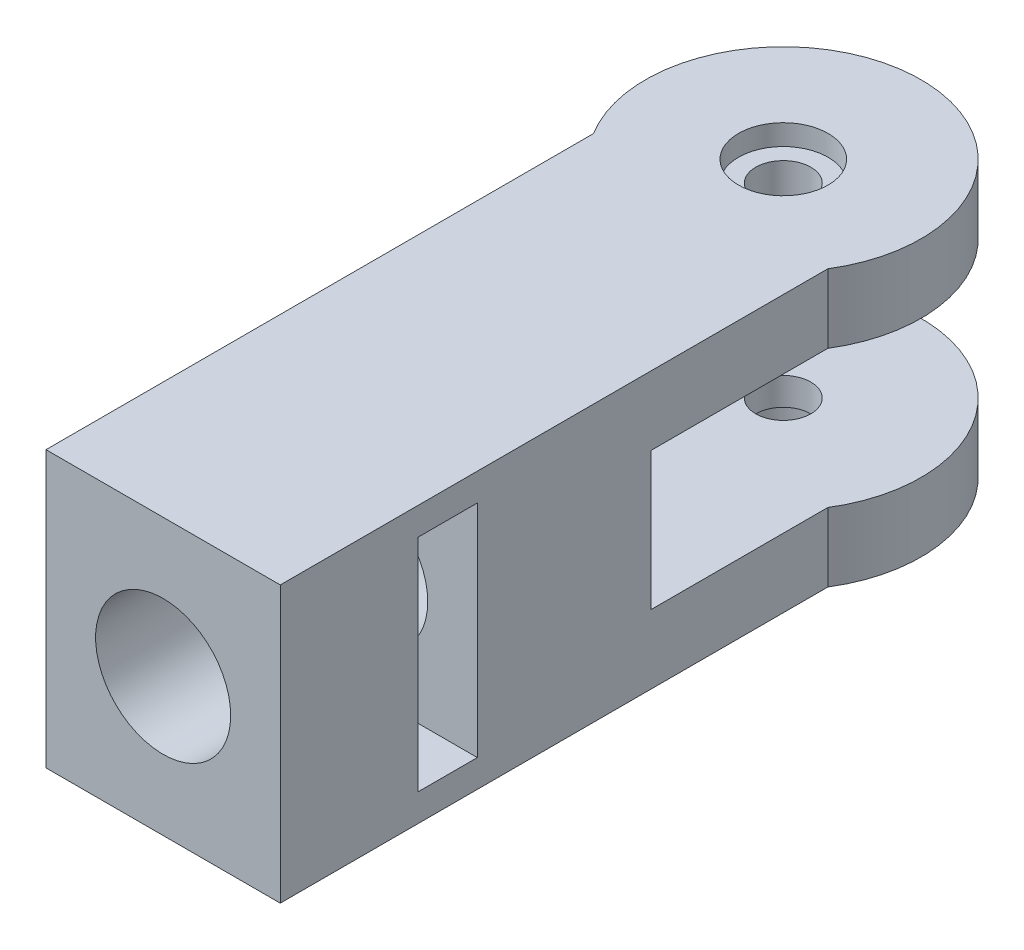
ISO-10303-21;
HEADER;
FILE_DESCRIPTION(('STEP AP214'),'2;1');
FILE_NAME('part.step','',(''),(''),'','','');
FILE_SCHEMA(('AUTOMOTIVE_DESIGN { 1 0 10303 214 1 1 1 1 }'));
ENDSEC;
DATA;
#1=APPLICATION_CONTEXT('core data for automotive mechanical design processes');
#2=APPLICATION_PROTOCOL_DEFINITION('international standard','automotive_design',2000,#1);
#3=PRODUCT_CONTEXT('',#1,'mechanical');
#4=PRODUCT('Part','Part','',(#3));
#5=PRODUCT_RELATED_PRODUCT_CATEGORY('part','',(#4));
#6=PRODUCT_DEFINITION_FORMATION('','',#4);
#7=PRODUCT_DEFINITION_CONTEXT('part definition',#1,'design');
#8=PRODUCT_DEFINITION('design','',#6,#7);
#9=PRODUCT_DEFINITION_SHAPE('','',#8);
#10=(LENGTH_UNIT() NAMED_UNIT(*) SI_UNIT(.MILLI.,.METRE.));
#11=(NAMED_UNIT(*) PLANE_ANGLE_UNIT() SI_UNIT($,.RADIAN.));
#12=(NAMED_UNIT(*) SI_UNIT($,.STERADIAN.) SOLID_ANGLE_UNIT());
#13=UNCERTAINTY_MEASURE_WITH_UNIT(LENGTH_MEASURE(1.E-05),#10,'distance_accuracy_value','');
#14=(GEOMETRIC_REPRESENTATION_CONTEXT(3) GLOBAL_UNCERTAINTY_ASSIGNED_CONTEXT((#13)) GLOBAL_UNIT_ASSIGNED_CONTEXT((#10,
#11,#12)) REPRESENTATION_CONTEXT('',''));
#15=CARTESIAN_POINT('',(0.,0.,0.));
#16=DIRECTION('',(0.,0.,1.));
#17=DIRECTION('',(1.,0.,0.));
#18=AXIS2_PLACEMENT_3D('',#15,#16,#17);
#19=CARTESIAN_POINT('',(-10.8284462163294,-12.3437960912953,-5.));
#20=DIRECTION('',(0.,1.,0.));
#21=DIRECTION('',(0.,0.,1.));
#22=AXIS2_PLACEMENT_3D('',#19,#20,#21);
#23=CYLINDRICAL_SURFACE('',#22,2.);
#24=CARTESIAN_POINT('',(-10.8284462163294,-12.3437960912953,-5.));
#25=DIRECTION('',(0.,1.,0.));
#26=DIRECTION('',(0.,0.,1.));
#27=AXIS2_PLACEMENT_3D('',#24,#25,#26);
#28=CIRCLE('',#27,2.);
#29=CARTESIAN_POINT('',(-10.8284462163294,-12.3437960912953,-3.));
#30=VERTEX_POINT('',#29);
#31=EDGE_CURVE('E295',#30,#30,#28,.T.);
#32=ORIENTED_EDGE('',*,*,#31,.F.);
#33=EDGE_LOOP('',(#32));
#34=FACE_BOUND('',#33,.T.);
#35=CARTESIAN_POINT('',(-10.8284462163294,-8.8437960912953,-5.));
#36=DIRECTION('',(0.,1.,0.));
#37=DIRECTION('',(0.,0.,1.));
#38=AXIS2_PLACEMENT_3D('',#35,#36,#37);
#39=CIRCLE('',#38,2.);
#40=CARTESIAN_POINT('',(-10.8284462163294,-8.8437960912953,-3.));
#41=VERTEX_POINT('',#40);
#42=EDGE_CURVE('E43',#41,#41,#39,.F.);
#43=ORIENTED_EDGE('',*,*,#42,.F.);
#44=EDGE_LOOP('',(#43));
#45=FACE_BOUND('',#44,.T.);
#46=ADVANCED_FACE('F39',(#34,#45),#23,.F.);
#47=CARTESIAN_POINT('',(-10.8284462163294,-17.3437960912953,-5.));
#48=DIRECTION('',(0.,-1.,0.));
#49=DIRECTION('',(0.,0.,-1.));
#50=AXIS2_PLACEMENT_3D('',#47,#48,#49);
#51=CYLINDRICAL_SURFACE('',#50,2.);
#52=CARTESIAN_POINT('',(-10.8284462163294,-22.3437960912953,-5.));
#53=DIRECTION('',(0.,-1.,0.));
#54=DIRECTION('',(0.,0.,-1.));
#55=AXIS2_PLACEMENT_3D('',#52,#53,#54);
#56=CIRCLE('',#55,2.);
#57=CARTESIAN_POINT('',(-10.8284462163294,-22.3437960912953,-7.));
#58=VERTEX_POINT('',#57);
#59=EDGE_CURVE('E357',#58,#58,#56,.F.);
#60=ORIENTED_EDGE('',*,*,#59,.T.);
#61=EDGE_LOOP('',(#60));
#62=FACE_BOUND('',#61,.T.);
#63=CARTESIAN_POINT('',(-10.8284462163294,-24.3437960912953,-5.));
#64=DIRECTION('',(0.,-1.,0.));
#65=DIRECTION('',(0.,0.,-1.));
#66=AXIS2_PLACEMENT_3D('',#63,#64,#65);
#67=CIRCLE('',#66,2.);
#68=CARTESIAN_POINT('',(-10.8284462163294,-24.3437960912953,-7.));
#69=VERTEX_POINT('',#68);
#70=EDGE_CURVE('E179',#69,#69,#67,.F.);
#71=ORIENTED_EDGE('',*,*,#70,.F.);
#72=EDGE_LOOP('',(#71));
#73=FACE_BOUND('',#72,.T.);
#74=ADVANCED_FACE('F235',(#62,#73),#51,.F.);
#75=CARTESIAN_POINT('',(-10.8284462163294,-17.3437960912953,-15.001));
#76=DIRECTION('',(0.,0.,1.));
#77=DIRECTION('',(1.,0.,0.));
#78=AXIS2_PLACEMENT_3D('',#75,#76,#77);
#79=CYLINDRICAL_SURFACE('',#78,4.9);
#80=CARTESIAN_POINT('',(-5.92844621632943,-17.3437960912953,14.3904615726393));
#81=CARTESIAN_POINT('',(-5.92845421187002,-17.0730305822348,14.390466836647));
#82=CARTESIAN_POINT('',(-5.95096569837711,-16.8021753930176,14.3961948742794));
#83=CARTESIAN_POINT('',(-6.04028096403182,-16.2682303632026,14.4184324169081));
#84=CARTESIAN_POINT('',(-6.10711155983043,-16.0051453249097,14.4349484494241));
#85=CARTESIAN_POINT('',(-6.28278262721583,-15.4945410194833,14.4767817058605));
#86=CARTESIAN_POINT('',(-6.39157024861944,-15.2470026237109,14.5020878535491));
#87=CARTESIAN_POINT('',(-6.64790780286381,-14.773666655628,14.5586362742684));
#88=CARTESIAN_POINT('',(-6.79545897894448,-14.5478697809376,14.5898787376819));
#89=CARTESIAN_POINT('',(-7.12846625109194,-14.1196522837573,14.6555187711861));
#90=CARTESIAN_POINT('',(-7.31459094887499,-13.9177589802424,14.689965111723));
#91=CARTESIAN_POINT('',(-7.71802116848874,-13.5477206093492,14.7577079541276));
#92=CARTESIAN_POINT('',(-7.93532951505637,-13.379578602609,14.7910043514894));
#93=CARTESIAN_POINT('',(-8.398558175947,-13.0796702842973,14.8532339162052));
#94=CARTESIAN_POINT('',(-8.64482208806588,-12.9484201951387,14.8821028179867));
#95=CARTESIAN_POINT('',(-9.15674157770436,-12.7293750914336,14.9316691729253));
#96=CARTESIAN_POINT('',(-9.42239440463474,-12.641573926745,14.9523677824932));
#97=CARTESIAN_POINT('',(-9.96005567482653,-12.5136029488592,14.9829166289941));
#98=CARTESIAN_POINT('',(-10.2318393291114,-12.4725381339847,14.992970442403));
#99=CARTESIAN_POINT('',(-10.7786115744878,-12.4363980389177,15.0018056335116));
#100=CARTESIAN_POINT('',(-11.0535997042138,-12.4413162180527,15.0005886143873));
#101=CARTESIAN_POINT('',(-11.5927739914371,-12.4963549407262,14.9871714891069));
#102=CARTESIAN_POINT('',(-11.8570654557443,-12.5455096586751,14.9752060653387));
#103=CARTESIAN_POINT('',(-12.3735285231842,-12.6860759486135,14.941908814917));
#104=CARTESIAN_POINT('',(-12.6256994950438,-12.7774897189586,14.920576500992));
#105=CARTESIAN_POINT('',(-13.1133307824882,-13.0007727315112,14.8705802583798));
#106=CARTESIAN_POINT('',(-13.3486253230541,-13.1329894198964,14.8418537290024));
#107=CARTESIAN_POINT('',(-13.7940282648562,-13.4338623681088,14.7801909505205));
#108=CARTESIAN_POINT('',(-14.0041324310857,-13.6025247418668,14.7472539954769));
#109=CARTESIAN_POINT('',(-14.3989484956875,-13.9766928727732,14.679754139733));
#110=CARTESIAN_POINT('',(-14.5828576578348,-14.1830429338426,14.6451712310446));
#111=CARTESIAN_POINT('',(-14.9136357843126,-14.6240172989917,14.5790643388574));
#112=CARTESIAN_POINT('',(-15.0605031551159,-14.8586428188321,14.5475404869942));
#113=CARTESIAN_POINT('',(-15.3135154257523,-15.3510354430131,14.4910521206441));
#114=CARTESIAN_POINT('',(-15.4194741528938,-15.6089019070611,14.4661177529899));
#115=CARTESIAN_POINT('',(-15.5862911237352,-16.1395447259527,14.426022539283));
#116=CARTESIAN_POINT('',(-15.6471585869803,-16.4123180206306,14.410859695387));
#117=CARTESIAN_POINT('',(-15.7207481373513,-16.957605340365,14.3924417327698));
#118=CARTESIAN_POINT('',(-15.734654074124,-17.22994990013,14.3888938843356));
#119=CARTESIAN_POINT('',(-15.7171608565413,-17.7730678049611,14.3933120000398));
#120=CARTESIAN_POINT('',(-15.6857656898011,-18.0438412862144,14.401276950768));
#121=CARTESIAN_POINT('',(-15.5795977396745,-18.571781547678,14.4275433735623));
#122=CARTESIAN_POINT('',(-15.5055078728453,-18.8290945321996,14.445681995111));
#123=CARTESIAN_POINT('',(-15.3168078145486,-19.3276497898135,14.4900986781767));
#124=CARTESIAN_POINT('',(-15.2021929709409,-19.5688902140462,14.5163776741402));
#125=CARTESIAN_POINT('',(-14.9331968618406,-20.0334865294364,14.5747349452911));
#126=CARTESIAN_POINT('',(-14.7781041842389,-20.2564176437657,14.6069135439362));
#127=CARTESIAN_POINT('',(-14.4334596443894,-20.673525066127,14.6731951638474));
#128=CARTESIAN_POINT('',(-14.2439023534835,-20.8676968354045,14.7072984877003));
#129=CARTESIAN_POINT('',(-13.8302888939382,-21.226535404248,14.7745745221707));
#130=CARTESIAN_POINT('',(-13.6055158754036,-21.390385201367,14.8077054501664));
#131=CARTESIAN_POINT('',(-13.1309563852055,-21.6780105687773,14.8684570255253));
#132=CARTESIAN_POINT('',(-12.8811712039765,-21.8017882050896,14.8960779569421));
#133=CARTESIAN_POINT('',(-12.3653854987203,-22.0047027410313,14.9425253677447));
#134=CARTESIAN_POINT('',(-12.0995152026358,-22.0841557803633,14.9614139592537));
#135=CARTESIAN_POINT('',(-11.5576745490405,-22.1971223803765,14.9885398664134));
#136=CARTESIAN_POINT('',(-11.2817060682464,-22.2306444331167,14.9967791509705));
#137=CARTESIAN_POINT('',(-10.7351910564071,-22.2503357012441,15.0016013992384));
#138=CARTESIAN_POINT('',(-10.464689998853,-22.2377128647546,14.998481718511));
#139=CARTESIAN_POINT('',(-9.92978855613179,-22.1682285193041,14.9815922084288));
#140=CARTESIAN_POINT('',(-9.66538800271084,-22.1113682319311,14.9678226731626));
#141=CARTESIAN_POINT('',(-9.15140231347793,-21.9556600520965,14.9312226910022));
#142=CARTESIAN_POINT('',(-8.90174992187247,-21.8570227807396,14.9084377332923));
#143=CARTESIAN_POINT('',(-8.42239865219622,-21.62075316907,14.856211525684));
#144=CARTESIAN_POINT('',(-8.1927022048094,-21.4831160871589,14.826769466503));
#145=CARTESIAN_POINT('',(-7.7540266990393,-21.1690269660693,14.763558402976));
#146=CARTESIAN_POINT('',(-7.54565032033427,-20.9917501517624,14.7297050110989));
#147=CARTESIAN_POINT('',(-7.16119317975817,-20.6050257627831,14.6618780984885));
#148=CARTESIAN_POINT('',(-6.98512053813818,-20.3955701235041,14.6279045497328));
#149=CARTESIAN_POINT('',(-6.66721298546203,-19.9459640521708,14.5630006103845));
#150=CARTESIAN_POINT('',(-6.52604034877764,-19.7053353073891,14.5321348431757));
#151=CARTESIAN_POINT('',(-6.28636348345391,-19.2030413455138,14.4778000609114));
#152=CARTESIAN_POINT('',(-6.18782733322012,-18.941392040976,14.4543255157061));
#153=CARTESIAN_POINT('',(-6.05139073950828,-18.4573573679935,14.4212152402645));
#154=CARTESIAN_POINT('',(-6.00538491545069,-18.2373455094658,14.4097676056759));
#155=CARTESIAN_POINT('',(-5.9439105309623,-17.7928414570813,14.3943888826095));
#156=CARTESIAN_POINT('',(-5.92843958540063,-17.5683496145474,14.3904572070483));
#157=CARTESIAN_POINT('',(-5.92844621632943,-17.3437960912953,14.3904615726393));
#158=B_SPLINE_CURVE_WITH_KNOTS('',3,(#80,#81,#82,#83,#84,#85,#86,#87,#88,#89,#90,#91,#92,#93,
#94,#95,#96,#97,#98,#99,#100,#101,#102,#103,#104,#105,#106,#107,#108,#109,#110,#111,#112,#113,
#114,#115,#116,#117,#118,#119,#120,#121,#122,#123,#124,#125,#126,#127,#128,#129,#130,#131,#132,
#133,#134,#135,#136,#137,#138,#139,#140,#141,#142,#143,#144,#145,#146,#147,#148,#149,#150,#151,
#152,#153,#154,#155,#156,#157),.UNSPECIFIED.,.T.,.F.,(4,2,2,2,2,2,2,2,2,2,2,2,2,2,2,2,2,2,2,2,2,
2,2,2,2,2,2,2,2,2,2,2,2,2,2,2,2,2,4),(0.,0.811472192122354,1.62343583920502,2.43438003820027,
3.24535024929145,4.07177094213743,4.89826654271494,5.73580880662824,6.57323248352298,
7.39433441691282,8.21531955762093,9.0188035430232,9.82232933111895,10.6328954758836,
11.443597702542,12.2753895002255,13.1072170752534,13.9427868358341,14.7781857051965,
15.5923612462417,16.406465124119,17.2078949446123,18.0094167966224,18.8261047920005,
19.6429215387718,20.4792795952618,21.3155945243408,22.1458656797084,22.9759833077086,
23.7845281558237,24.5930506772971,25.3975446158279,26.2021364067572,27.0253537952096,
27.848777834686,28.686798954286,29.5241915640066,30.197221062847,30.8701979881371),.UNSPECIFIED.);
#159=CARTESIAN_POINT('',(-5.92844621632943,-17.3437960912953,14.3904615726393));
#160=VERTEX_POINT('',#159);
#161=EDGE_CURVE('E186',#160,#160,#158,.T.);
#162=ORIENTED_EDGE('',*,*,#161,.F.);
#163=EDGE_LOOP('',(#162));
#164=FACE_BOUND('',#163,.T.);
#165=CARTESIAN_POINT('',(-10.8284462163294,-17.3437960912953,25.7));
#166=DIRECTION('',(0.,0.,1.));
#167=DIRECTION('',(0.,-1.,0.));
#168=AXIS2_PLACEMENT_3D('',#165,#166,#167);
#169=CIRCLE('',#168,4.9);
#170=CARTESIAN_POINT('',(-10.8284462163294,-22.2437960912953,25.7));
#171=VERTEX_POINT('',#170);
#172=EDGE_CURVE('E176',#171,#171,#169,.T.);
#173=ORIENTED_EDGE('',*,*,#172,.T.);
#174=EDGE_LOOP('',(#173));
#175=FACE_BOUND('',#174,.T.);
#176=ADVANCED_FACE('F241',(#164,#175),#79,.F.);
#177=CARTESIAN_POINT('',(-19.3284462163294,-27.3437960912953,40.));
#178=DIRECTION('',(0.,1.,0.));
#179=DIRECTION('',(0.,0.,1.));
#180=AXIS2_PLACEMENT_3D('',#177,#178,#179);
#181=PLANE('',#180);
#182=CARTESIAN_POINT('',(-10.8284462163294,-27.3437960912953,-5.));
#183=DIRECTION('',(0.,-1.,0.));
#184=DIRECTION('',(0.,0.,-1.));
#185=AXIS2_PLACEMENT_3D('',#182,#183,#184);
#186=CIRCLE('',#185,3.25);
#187=CARTESIAN_POINT('',(-10.8284462163294,-27.3437960912953,-8.25));
#188=VERTEX_POINT('',#187);
#189=EDGE_CURVE('E368',#188,#188,#186,.T.);
#190=ORIENTED_EDGE('',*,*,#189,.F.);
#191=EDGE_LOOP('',(#190));
#192=FACE_BOUND('',#191,.T.);
#193=DIRECTION('',(0.,0.,-1.));
#194=VECTOR('',#193,1.);
#195=CARTESIAN_POINT('',(-19.3284462163294,-27.3437960912953,40.));
#196=LINE('',#195,#194);
#197=CARTESIAN_POINT('',(-19.3284462163294,-27.3437960912953,40.));
#198=VERTEX_POINT('',#197);
#199=CARTESIAN_POINT('',(-19.3284462163294,-27.3437960912953,0.267826876426372));
#200=VERTEX_POINT('',#199);
#201=EDGE_CURVE('E337',#198,#200,#196,.T.);
#202=ORIENTED_EDGE('',*,*,#201,.T.);
#203=CARTESIAN_POINT('',(-10.8284462163294,-27.3437960912953,-5.));
#204=DIRECTION('',(0.,-1.,0.));
#205=DIRECTION('',(0.,0.,-1.));
#206=AXIS2_PLACEMENT_3D('',#203,#204,#205);
#207=CIRCLE('',#206,10.);
#208=CARTESIAN_POINT('',(-2.32844621632943,-27.3437960912953,0.267826876426367));
#209=VERTEX_POINT('',#208);
#210=EDGE_CURVE('E317',#200,#209,#207,.T.);
#211=ORIENTED_EDGE('',*,*,#210,.T.);
#212=DIRECTION('',(0.,0.,-1.));
#213=VECTOR('',#212,1.);
#214=CARTESIAN_POINT('',(-2.32844621632943,-27.3437960912953,40.));
#215=LINE('',#214,#213);
#216=CARTESIAN_POINT('',(-2.32844621632943,-27.3437960912953,40.));
#217=VERTEX_POINT('',#216);
#218=EDGE_CURVE('E348',#217,#209,#215,.T.);
#219=ORIENTED_EDGE('',*,*,#218,.F.);
#220=DIRECTION('',(1.,0.,0.));
#221=VECTOR('',#220,1.);
#222=CARTESIAN_POINT('',(-19.3284462163294,-27.3437960912953,40.));
#223=LINE('',#222,#221);
#224=EDGE_CURVE('E323',#198,#217,#223,.T.);
#225=ORIENTED_EDGE('',*,*,#224,.F.);
#226=EDGE_LOOP('',(#202,#211,#219,#225));
#227=FACE_BOUND('',#226,.T.);
#228=ADVANCED_FACE('F41',(#192,#227),#181,.F.);
#229=CARTESIAN_POINT('',(-2.32844621632943,-7.3437960912953,40.));
#230=DIRECTION('',(1.,0.,0.));
#231=DIRECTION('',(0.,1.,0.));
#232=AXIS2_PLACEMENT_3D('',#229,#230,#231);
#233=PLANE('',#232);
#234=DIRECTION('',(0.,-1.,0.));
#235=VECTOR('',#234,1.);
#236=CARTESIAN_POINT('',(-2.32844621632943,-9.3437960912953,30.));
#237=LINE('',#236,#235);
#238=CARTESIAN_POINT('',(-2.32844621632943,-9.3437960912953,30.));
#239=VERTEX_POINT('',#238);
#240=CARTESIAN_POINT('',(-2.32844621632943,-25.3437960912953,30.));
#241=VERTEX_POINT('',#240);
#242=EDGE_CURVE('E144',#239,#241,#237,.T.);
#243=ORIENTED_EDGE('',*,*,#242,.F.);
#244=DIRECTION('',(0.,0.,-1.));
#245=VECTOR('',#244,1.);
#246=CARTESIAN_POINT('',(-2.32844621632943,-9.3437960912953,30.));
#247=LINE('',#246,#245);
#248=CARTESIAN_POINT('',(-2.32844621632943,-9.3437960912953,25.7));
#249=VERTEX_POINT('',#248);
#250=EDGE_CURVE('E162',#239,#249,#247,.T.);
#251=ORIENTED_EDGE('',*,*,#250,.T.);
#252=DIRECTION('',(0.,-1.,0.));
#253=VECTOR('',#252,1.);
#254=CARTESIAN_POINT('',(-2.32844621632943,-9.3437960912953,25.7));
#255=LINE('',#254,#253);
#256=CARTESIAN_POINT('',(-2.32844621632943,-25.3437960912953,25.7));
#257=VERTEX_POINT('',#256);
#258=EDGE_CURVE('E154',#249,#257,#255,.T.);
#259=ORIENTED_EDGE('',*,*,#258,.T.);
#260=DIRECTION('',(0.,0.,-1.));
#261=VECTOR('',#260,1.);
#262=CARTESIAN_POINT('',(-2.32844621632943,-25.3437960912953,30.));
#263=LINE('',#262,#261);
#264=EDGE_CURVE('E57',#241,#257,#263,.T.);
#265=ORIENTED_EDGE('',*,*,#264,.F.);
#266=EDGE_LOOP('',(#243,#251,#259,#265));
#267=FACE_BOUND('',#266,.T.);
#268=DIRECTION('',(0.,0.,-1.));
#269=VECTOR('',#268,1.);
#270=CARTESIAN_POINT('',(-2.32844621632943,-22.3437960912953,40.));
#271=LINE('',#270,#269);
#272=CARTESIAN_POINT('',(-2.32844621632943,-22.3437960912953,13.1038669902317));
#273=VERTEX_POINT('',#272);
#274=CARTESIAN_POINT('',(-2.32844621632943,-22.3437960912953,0.267826876426367));
#275=VERTEX_POINT('',#274);
#276=EDGE_CURVE('E283',#273,#275,#271,.T.);
#277=ORIENTED_EDGE('',*,*,#276,.F.);
#278=DIRECTION('',(0.,1.,0.));
#279=VECTOR('',#278,1.);
#280=CARTESIAN_POINT('',(-2.32844621632943,-22.3437960912953,13.1038669902317));
#281=LINE('',#280,#279);
#282=CARTESIAN_POINT('',(-2.32844621632943,-12.3437960912953,13.1038669902317));
#283=VERTEX_POINT('',#282);
#284=EDGE_CURVE('E284',#273,#283,#281,.T.);
#285=ORIENTED_EDGE('',*,*,#284,.T.);
#286=DIRECTION('',(0.,0.,-1.));
#287=VECTOR('',#286,1.);
#288=CARTESIAN_POINT('',(-2.32844621632943,-12.3437960912953,40.));
#289=LINE('',#288,#287);
#290=CARTESIAN_POINT('',(-2.32844621632943,-12.3437960912953,0.267826876426372));
#291=VERTEX_POINT('',#290);
#292=EDGE_CURVE('E360',#283,#291,#289,.T.);
#293=ORIENTED_EDGE('',*,*,#292,.T.);
#294=DIRECTION('',(0.,1.,0.));
#295=VECTOR('',#294,1.);
#296=CARTESIAN_POINT('',(-2.32844621632943,-12.3437960912953,0.267826876426372));
#297=LINE('',#296,#295);
#298=CARTESIAN_POINT('',(-2.32844621632943,-7.3437960912953,0.267826876426372));
#299=VERTEX_POINT('',#298);
#300=EDGE_CURVE('E310',#299,#291,#297,.F.);
#301=ORIENTED_EDGE('',*,*,#300,.F.);
#302=DIRECTION('',(0.,0.,-1.));
#303=VECTOR('',#302,1.);
#304=CARTESIAN_POINT('',(-2.32844621632943,-7.3437960912953,40.));
#305=LINE('',#304,#303);
#306=CARTESIAN_POINT('',(-2.32844621632943,-7.3437960912953,40.));
#307=VERTEX_POINT('',#306);
#308=EDGE_CURVE('E344',#307,#299,#305,.T.);
#309=ORIENTED_EDGE('',*,*,#308,.F.);
#310=DIRECTION('',(0.,-1.,0.));
#311=VECTOR('',#310,1.);
#312=CARTESIAN_POINT('',(-2.32844621632943,-7.3437960912953,40.));
#313=LINE('',#312,#311);
#314=EDGE_CURVE('E326',#307,#217,#313,.T.);
#315=ORIENTED_EDGE('',*,*,#314,.T.);
#316=ORIENTED_EDGE('',*,*,#218,.T.);
#317=DIRECTION('',(0.,-1.,0.));
#318=VECTOR('',#317,1.);
#319=CARTESIAN_POINT('',(-2.32844621632943,-17.3437960912953,0.267826876426367));
#320=LINE('',#319,#318);
#321=EDGE_CURVE('E286',#275,#209,#320,.T.);
#322=ORIENTED_EDGE('',*,*,#321,.F.);
#323=EDGE_LOOP('',(#277,#285,#293,#301,#309,#315,#316,#322));
#324=FACE_BOUND('',#323,.T.);
#325=ADVANCED_FACE('F270',(#267,#324),#233,.T.);
#326=CARTESIAN_POINT('',(-19.3284462163294,-7.3437960912953,40.));
#327=DIRECTION('',(0.,1.,0.));
#328=DIRECTION('',(0.,0.,1.));
#329=AXIS2_PLACEMENT_3D('',#326,#327,#328);
#330=PLANE('',#329);
#331=CARTESIAN_POINT('',(-10.8284462163294,-7.3437960912953,-5.));
#332=DIRECTION('',(0.,1.,0.));
#333=DIRECTION('',(0.,0.,1.));
#334=AXIS2_PLACEMENT_3D('',#331,#332,#333);
#335=CIRCLE('',#334,3.25);
#336=CARTESIAN_POINT('',(-10.8284462163294,-7.3437960912953,-1.75));
#337=VERTEX_POINT('',#336);
#338=EDGE_CURVE('E375',#337,#337,#335,.T.);
#339=ORIENTED_EDGE('',*,*,#338,.F.);
#340=EDGE_LOOP('',(#339));
#341=FACE_BOUND('',#340,.T.);
#342=ORIENTED_EDGE('',*,*,#308,.T.);
#343=CARTESIAN_POINT('',(-10.8284462163294,-7.3437960912953,-5.));
#344=DIRECTION('',(0.,1.,0.));
#345=DIRECTION('',(0.,0.,1.));
#346=AXIS2_PLACEMENT_3D('',#343,#344,#345);
#347=CIRCLE('',#346,10.);
#348=CARTESIAN_POINT('',(-19.3284462163294,-7.3437960912953,0.267826876426361));
#349=VERTEX_POINT('',#348);
#350=EDGE_CURVE('E305',#299,#349,#347,.T.);
#351=ORIENTED_EDGE('',*,*,#350,.T.);
#352=DIRECTION('',(0.,0.,-1.));
#353=VECTOR('',#352,1.);
#354=CARTESIAN_POINT('',(-19.3284462163294,-7.3437960912953,40.));
#355=LINE('',#354,#353);
#356=CARTESIAN_POINT('',(-19.3284462163294,-7.3437960912953,40.));
#357=VERTEX_POINT('',#356);
#358=EDGE_CURVE('E341',#357,#349,#355,.T.);
#359=ORIENTED_EDGE('',*,*,#358,.F.);
#360=DIRECTION('',(1.,0.,0.));
#361=VECTOR('',#360,1.);
#362=CARTESIAN_POINT('',(-19.3284462163294,-7.3437960912953,40.));
#363=LINE('',#362,#361);
#364=EDGE_CURVE('E330',#357,#307,#363,.T.);
#365=ORIENTED_EDGE('',*,*,#364,.T.);
#366=EDGE_LOOP('',(#342,#351,#359,#365));
#367=FACE_BOUND('',#366,.T.);
#368=ADVANCED_FACE('F268',(#341,#367),#330,.T.);
#369=CARTESIAN_POINT('',(-19.3284462163294,-7.3437960912953,40.));
#370=DIRECTION('',(1.,0.,0.));
#371=DIRECTION('',(0.,1.,0.));
#372=AXIS2_PLACEMENT_3D('',#369,#370,#371);
#373=PLANE('',#372);
#374=DIRECTION('',(0.,0.,1.));
#375=VECTOR('',#374,1.);
#376=CARTESIAN_POINT('',(-19.3284462163294,-9.3437960912953,30.));
#377=LINE('',#376,#375);
#378=CARTESIAN_POINT('',(-19.3284462163294,-9.3437960912953,25.7));
#379=VERTEX_POINT('',#378);
#380=CARTESIAN_POINT('',(-19.3284462163294,-9.3437960912953,30.));
#381=VERTEX_POINT('',#380);
#382=EDGE_CURVE('E156',#379,#381,#377,.T.);
#383=ORIENTED_EDGE('',*,*,#382,.T.);
#384=DIRECTION('',(0.,1.,0.));
#385=VECTOR('',#384,1.);
#386=CARTESIAN_POINT('',(-19.3284462163294,-9.3437960912953,30.));
#387=LINE('',#386,#385);
#388=CARTESIAN_POINT('',(-19.3284462163294,-25.3437960912953,30.));
#389=VERTEX_POINT('',#388);
#390=EDGE_CURVE('E149',#389,#381,#387,.T.);
#391=ORIENTED_EDGE('',*,*,#390,.F.);
#392=DIRECTION('',(0.,0.,1.));
#393=VECTOR('',#392,1.);
#394=CARTESIAN_POINT('',(-19.3284462163294,-25.3437960912953,30.));
#395=LINE('',#394,#393);
#396=CARTESIAN_POINT('',(-19.3284462163294,-25.3437960912953,25.7));
#397=VERTEX_POINT('',#396);
#398=EDGE_CURVE('E141',#397,#389,#395,.T.);
#399=ORIENTED_EDGE('',*,*,#398,.F.);
#400=DIRECTION('',(0.,1.,0.));
#401=VECTOR('',#400,1.);
#402=CARTESIAN_POINT('',(-19.3284462163294,-9.3437960912953,25.7));
#403=LINE('',#402,#401);
#404=EDGE_CURVE('E129',#397,#379,#403,.T.);
#405=ORIENTED_EDGE('',*,*,#404,.T.);
#406=EDGE_LOOP('',(#383,#391,#399,#405));
#407=FACE_BOUND('',#406,.T.);
#408=DIRECTION('',(0.,1.,0.));
#409=VECTOR('',#408,1.);
#410=CARTESIAN_POINT('',(-19.3284462163294,-22.3437960912953,13.1038669902317));
#411=LINE('',#410,#409);
#412=CARTESIAN_POINT('',(-19.3284462163294,-22.3437960912953,13.1038669902317));
#413=VERTEX_POINT('',#412);
#414=CARTESIAN_POINT('',(-19.3284462163294,-12.3437960912953,13.1038669902317));
#415=VERTEX_POINT('',#414);
#416=EDGE_CURVE('E11',#413,#415,#411,.T.);
#417=ORIENTED_EDGE('',*,*,#416,.F.);
#418=DIRECTION('',(0.,0.,-1.));
#419=VECTOR('',#418,1.);
#420=CARTESIAN_POINT('',(-19.3284462163294,-22.3437960912953,40.));
#421=LINE('',#420,#419);
#422=CARTESIAN_POINT('',(-19.3284462163294,-22.3437960912953,0.26782687642637));
#423=VERTEX_POINT('',#422);
#424=EDGE_CURVE('E291',#413,#423,#421,.T.);
#425=ORIENTED_EDGE('',*,*,#424,.T.);
#426=DIRECTION('',(0.,-1.,0.));
#427=VECTOR('',#426,1.);
#428=CARTESIAN_POINT('',(-19.3284462163294,-17.3437960912953,0.267826876426367));
#429=LINE('',#428,#427);
#430=EDGE_CURVE('E351',#423,#200,#429,.T.);
#431=ORIENTED_EDGE('',*,*,#430,.T.);
#432=ORIENTED_EDGE('',*,*,#201,.F.);
#433=DIRECTION('',(0.,-1.,0.));
#434=VECTOR('',#433,1.);
#435=CARTESIAN_POINT('',(-19.3284462163294,-7.3437960912953,40.));
#436=LINE('',#435,#434);
#437=EDGE_CURVE('E334',#357,#198,#436,.T.);
#438=ORIENTED_EDGE('',*,*,#437,.F.);
#439=ORIENTED_EDGE('',*,*,#358,.T.);
#440=DIRECTION('',(0.,1.,0.));
#441=VECTOR('',#440,1.);
#442=CARTESIAN_POINT('',(-19.3284462163294,-12.3437960912953,0.267826876426363));
#443=LINE('',#442,#441);
#444=CARTESIAN_POINT('',(-19.3284462163294,-12.3437960912953,0.267826876426363));
#445=VERTEX_POINT('',#444);
#446=EDGE_CURVE('E49',#349,#445,#443,.F.);
#447=ORIENTED_EDGE('',*,*,#446,.T.);
#448=DIRECTION('',(0.,0.,-1.));
#449=VECTOR('',#448,1.);
#450=CARTESIAN_POINT('',(-19.3284462163294,-12.3437960912953,40.));
#451=LINE('',#450,#449);
#452=EDGE_CURVE('E404',#415,#445,#451,.T.);
#453=ORIENTED_EDGE('',*,*,#452,.F.);
#454=EDGE_LOOP('',(#417,#425,#431,#432,#438,#439,#447,#453));
#455=FACE_BOUND('',#454,.T.);
#456=ADVANCED_FACE('F147',(#407,#455),#373,.F.);
#457=CARTESIAN_POINT('',(0.,0.,40.));
#458=DIRECTION('',(0.,0.,-1.));
#459=DIRECTION('',(-1.,0.,0.));
#460=AXIS2_PLACEMENT_3D('',#457,#458,#459);
#461=PLANE('',#460);
#462=CARTESIAN_POINT('',(-10.8284462163294,-17.3437960912953,40.));
#463=DIRECTION('',(0.,0.,1.));
#464=DIRECTION('',(1.,0.,0.));
#465=AXIS2_PLACEMENT_3D('',#462,#463,#464);
#466=CIRCLE('',#465,4.9);
#467=CARTESIAN_POINT('',(-5.92844621632943,-17.3437960912953,40.));
#468=VERTEX_POINT('',#467);
#469=EDGE_CURVE('E181',#468,#468,#466,.T.);
#470=ORIENTED_EDGE('',*,*,#469,.F.);
#471=EDGE_LOOP('',(#470));
#472=FACE_BOUND('',#471,.T.);
#473=ORIENTED_EDGE('',*,*,#224,.T.);
#474=ORIENTED_EDGE('',*,*,#314,.F.);
#475=ORIENTED_EDGE('',*,*,#364,.F.);
#476=ORIENTED_EDGE('',*,*,#437,.T.);
#477=EDGE_LOOP('',(#473,#474,#475,#476));
#478=FACE_BOUND('',#477,.T.);
#479=ADVANCED_FACE('F261',(#472,#478),#461,.F.);
#480=CARTESIAN_POINT('',(-10.8284462163294,-17.3437960912953,-5.));
#481=DIRECTION('',(0.,-1.,0.));
#482=DIRECTION('',(0.,0.,-1.));
#483=AXIS2_PLACEMENT_3D('',#480,#481,#482);
#484=CYLINDRICAL_SURFACE('',#483,10.);
#485=CARTESIAN_POINT('',(-10.8284462163294,-22.3437960912953,-5.));
#486=DIRECTION('',(0.,-1.,0.));
#487=DIRECTION('',(0.,0.,-1.));
#488=AXIS2_PLACEMENT_3D('',#485,#486,#487);
#489=CIRCLE('',#488,10.);
#490=EDGE_CURVE('E298',#275,#423,#489,.F.);
#491=ORIENTED_EDGE('',*,*,#490,.F.);
#492=ORIENTED_EDGE('',*,*,#321,.T.);
#493=ORIENTED_EDGE('',*,*,#210,.F.);
#494=ORIENTED_EDGE('',*,*,#430,.F.);
#495=EDGE_LOOP('',(#491,#492,#493,#494));
#496=FACE_BOUND('',#495,.T.);
#497=ADVANCED_FACE('F256',(#496),#484,.T.);
#498=CARTESIAN_POINT('',(-10.8284462163294,-12.3437960912953,-5.));
#499=DIRECTION('',(0.,1.,0.));
#500=DIRECTION('',(0.,0.,1.));
#501=AXIS2_PLACEMENT_3D('',#498,#499,#500);
#502=CYLINDRICAL_SURFACE('',#501,10.);
#503=ORIENTED_EDGE('',*,*,#350,.F.);
#504=ORIENTED_EDGE('',*,*,#300,.T.);
#505=CARTESIAN_POINT('',(-10.8284462163294,-12.3437960912953,-5.));
#506=DIRECTION('',(0.,1.,0.));
#507=DIRECTION('',(0.,0.,1.));
#508=AXIS2_PLACEMENT_3D('',#505,#506,#507);
#509=CIRCLE('',#508,10.);
#510=EDGE_CURVE('E306',#291,#445,#509,.T.);
#511=ORIENTED_EDGE('',*,*,#510,.T.);
#512=ORIENTED_EDGE('',*,*,#446,.F.);
#513=EDGE_LOOP('',(#503,#504,#511,#512));
#514=FACE_BOUND('',#513,.T.);
#515=ADVANCED_FACE('F253',(#514),#502,.T.);
#516=CARTESIAN_POINT('',(-10.8284462163294,-12.3437960912953,-5.));
#517=DIRECTION('',(0.,1.,0.));
#518=DIRECTION('',(0.,0.,1.));
#519=AXIS2_PLACEMENT_3D('',#516,#517,#518);
#520=PLANE('',#519);
#521=ORIENTED_EDGE('',*,*,#510,.F.);
#522=ORIENTED_EDGE('',*,*,#292,.F.);
#523=CARTESIAN_POINT('',(-10.8284462163294,-12.3437960912953,-5.));
#524=DIRECTION('',(0.,-1.,0.));
#525=DIRECTION('',(0.,0.,-1.));
#526=AXIS2_PLACEMENT_3D('',#523,#524,#525);
#527=CIRCLE('',#526,20.);
#528=EDGE_CURVE('E185',#283,#415,#527,.T.);
#529=ORIENTED_EDGE('',*,*,#528,.T.);
#530=ORIENTED_EDGE('',*,*,#452,.T.);
#531=EDGE_LOOP('',(#521,#522,#529,#530));
#532=FACE_BOUND('',#531,.T.);
#533=ORIENTED_EDGE('',*,*,#31,.T.);
#534=EDGE_LOOP('',(#533));
#535=FACE_BOUND('',#534,.T.);
#536=ADVANCED_FACE('F249',(#532,#535),#520,.F.);
#537=CARTESIAN_POINT('',(-10.8284462163294,-22.3437960912953,-5.));
#538=DIRECTION('',(0.,-1.,0.));
#539=DIRECTION('',(0.,0.,-1.));
#540=AXIS2_PLACEMENT_3D('',#537,#538,#539);
#541=PLANE('',#540);
#542=ORIENTED_EDGE('',*,*,#276,.T.);
#543=ORIENTED_EDGE('',*,*,#490,.T.);
#544=ORIENTED_EDGE('',*,*,#424,.F.);
#545=CARTESIAN_POINT('',(-10.8284462163294,-22.3437960912953,-5.));
#546=DIRECTION('',(0.,-1.,0.));
#547=DIRECTION('',(0.,0.,-1.));
#548=AXIS2_PLACEMENT_3D('',#545,#546,#547);
#549=CIRCLE('',#548,20.);
#550=EDGE_CURVE('E195',#273,#413,#549,.T.);
#551=ORIENTED_EDGE('',*,*,#550,.F.);
#552=EDGE_LOOP('',(#542,#543,#544,#551));
#553=FACE_BOUND('',#552,.T.);
#554=ORIENTED_EDGE('',*,*,#59,.F.);
#555=EDGE_LOOP('',(#554));
#556=FACE_BOUND('',#555,.T.);
#557=ADVANCED_FACE('F252',(#553,#556),#541,.F.);
#558=CARTESIAN_POINT('',(-10.8284462163294,-22.3437960912953,-5.));
#559=DIRECTION('',(0.,1.,0.));
#560=DIRECTION('',(0.,0.,1.));
#561=AXIS2_PLACEMENT_3D('',#558,#559,#560);
#562=CYLINDRICAL_SURFACE('',#561,20.);
#563=ORIENTED_EDGE('',*,*,#161,.T.);
#564=EDGE_LOOP('',(#563));
#565=FACE_BOUND('',#564,.T.);
#566=ORIENTED_EDGE('',*,*,#550,.T.);
#567=ORIENTED_EDGE('',*,*,#416,.T.);
#568=ORIENTED_EDGE('',*,*,#528,.F.);
#569=ORIENTED_EDGE('',*,*,#284,.F.);
#570=EDGE_LOOP('',(#566,#567,#568,#569));
#571=FACE_BOUND('',#570,.T.);
#572=ADVANCED_FACE('F248',(#565,#571),#562,.F.);
#573=CARTESIAN_POINT('',(-10.8284462163294,-17.3437960912953,30.));
#574=DIRECTION('',(0.,0.,1.));
#575=DIRECTION('',(1.,0.,0.));
#576=AXIS2_PLACEMENT_3D('',#573,#574,#575);
#577=CIRCLE('',#576,4.9);
#578=CARTESIAN_POINT('',(-5.92844621632943,-17.3437960912953,30.));
#579=VERTEX_POINT('',#578);
#580=EDGE_CURVE('E137',#579,#579,#577,.T.);
#581=CARTESIAN_POINT('',(-5.92844621632943,-17.3437960912953,30.));
#582=CARTESIAN_POINT('',(-5.92844621632943,-17.3437960912953,30.1041666666667));
#583=CARTESIAN_POINT('',(-5.92844621632943,-17.3437960912953,30.2083333333333));
#584=CARTESIAN_POINT('',(-5.92844621632943,-17.3437960912953,30.4166666666667));
#585=CARTESIAN_POINT('',(-5.92844621632943,-17.3437960912953,30.5208333333333));
#586=CARTESIAN_POINT('',(-5.92844621632943,-17.3437960912953,30.7291666666667));
#587=CARTESIAN_POINT('',(-5.92844621632943,-17.3437960912953,30.8333333333333));
#588=CARTESIAN_POINT('',(-5.92844621632943,-17.3437960912953,31.0416666666667));
#589=CARTESIAN_POINT('',(-5.92844621632943,-17.3437960912953,31.1458333333333));
#590=CARTESIAN_POINT('',(-5.92844621632943,-17.3437960912953,31.3541666666667));
#591=CARTESIAN_POINT('',(-5.92844621632943,-17.3437960912953,31.4583333333333));
#592=CARTESIAN_POINT('',(-5.92844621632943,-17.3437960912953,31.6666666666667));
#593=CARTESIAN_POINT('',(-5.92844621632943,-17.3437960912953,31.7708333333333));
#594=CARTESIAN_POINT('',(-5.92844621632943,-17.3437960912953,31.9791666666667));
#595=CARTESIAN_POINT('',(-5.92844621632943,-17.3437960912953,32.0833333333333));
#596=CARTESIAN_POINT('',(-5.92844621632943,-17.3437960912953,32.2916666666667));
#597=CARTESIAN_POINT('',(-5.92844621632943,-17.3437960912953,32.3958333333333));
#598=CARTESIAN_POINT('',(-5.92844621632943,-17.3437960912953,32.6041666666667));
#599=CARTESIAN_POINT('',(-5.92844621632943,-17.3437960912953,32.7083333333333));
#600=CARTESIAN_POINT('',(-5.92844621632943,-17.3437960912953,32.9166666666667));
#601=CARTESIAN_POINT('',(-5.92844621632943,-17.3437960912953,33.0208333333333));
#602=CARTESIAN_POINT('',(-5.92844621632943,-17.3437960912953,33.2291666666667));
#603=CARTESIAN_POINT('',(-5.92844621632943,-17.3437960912953,33.3333333333333));
#604=CARTESIAN_POINT('',(-5.92844621632943,-17.3437960912953,33.5416666666667));
#605=CARTESIAN_POINT('',(-5.92844621632943,-17.3437960912953,33.6458333333333));
#606=CARTESIAN_POINT('',(-5.92844621632943,-17.3437960912953,33.8541666666667));
#607=CARTESIAN_POINT('',(-5.92844621632943,-17.3437960912953,33.9583333333333));
#608=CARTESIAN_POINT('',(-5.92844621632943,-17.3437960912953,34.1666666666667));
#609=CARTESIAN_POINT('',(-5.92844621632943,-17.3437960912953,34.2708333333333));
#610=CARTESIAN_POINT('',(-5.92844621632943,-17.3437960912953,34.4791666666667));
#611=CARTESIAN_POINT('',(-5.92844621632943,-17.3437960912953,34.5833333333333));
#612=CARTESIAN_POINT('',(-5.92844621632943,-17.3437960912953,34.7916666666667));
#613=CARTESIAN_POINT('',(-5.92844621632943,-17.3437960912953,34.8958333333333));
#614=CARTESIAN_POINT('',(-5.92844621632943,-17.3437960912953,35.1041666666667));
#615=CARTESIAN_POINT('',(-5.92844621632943,-17.3437960912953,35.2083333333333));
#616=CARTESIAN_POINT('',(-5.92844621632943,-17.3437960912953,35.4166666666667));
#617=CARTESIAN_POINT('',(-5.92844621632943,-17.3437960912953,35.5208333333333));
#618=CARTESIAN_POINT('',(-5.92844621632943,-17.3437960912953,35.7291666666667));
#619=CARTESIAN_POINT('',(-5.92844621632943,-17.3437960912953,35.8333333333333));
#620=CARTESIAN_POINT('',(-5.92844621632943,-17.3437960912953,36.0416666666667));
#621=CARTESIAN_POINT('',(-5.92844621632943,-17.3437960912953,36.1458333333333));
#622=CARTESIAN_POINT('',(-5.92844621632943,-17.3437960912953,36.3541666666667));
#623=CARTESIAN_POINT('',(-5.92844621632943,-17.3437960912953,36.4583333333333));
#624=CARTESIAN_POINT('',(-5.92844621632943,-17.3437960912953,36.6666666666667));
#625=CARTESIAN_POINT('',(-5.92844621632943,-17.3437960912953,36.7708333333333));
#626=CARTESIAN_POINT('',(-5.92844621632943,-17.3437960912953,36.9791666666667));
#627=CARTESIAN_POINT('',(-5.92844621632943,-17.3437960912953,37.0833333333333));
#628=CARTESIAN_POINT('',(-5.92844621632943,-17.3437960912953,37.2916666666667));
#629=CARTESIAN_POINT('',(-5.92844621632943,-17.3437960912953,37.3958333333333));
#630=CARTESIAN_POINT('',(-5.92844621632943,-17.3437960912953,37.6041666666667));
#631=CARTESIAN_POINT('',(-5.92844621632943,-17.3437960912953,37.7083333333333));
#632=CARTESIAN_POINT('',(-5.92844621632943,-17.3437960912953,37.9166666666667));
#633=CARTESIAN_POINT('',(-5.92844621632943,-17.3437960912953,38.0208333333333));
#634=CARTESIAN_POINT('',(-5.92844621632943,-17.3437960912953,38.2291666666667));
#635=CARTESIAN_POINT('',(-5.92844621632943,-17.3437960912953,38.3333333333333));
#636=CARTESIAN_POINT('',(-5.92844621632943,-17.3437960912953,38.5416666666667));
#637=CARTESIAN_POINT('',(-5.92844621632943,-17.3437960912953,38.6458333333333));
#638=CARTESIAN_POINT('',(-5.92844621632943,-17.3437960912953,38.8541666666667));
#639=CARTESIAN_POINT('',(-5.92844621632943,-17.3437960912953,38.9583333333333));
#640=CARTESIAN_POINT('',(-5.92844621632943,-17.3437960912953,39.1666666666667));
#641=CARTESIAN_POINT('',(-5.92844621632943,-17.3437960912953,39.2708333333333));
#642=CARTESIAN_POINT('',(-5.92844621632943,-17.3437960912953,39.4791666666667));
#643=CARTESIAN_POINT('',(-5.92844621632943,-17.3437960912953,39.5833333333333));
#644=CARTESIAN_POINT('',(-5.92844621632943,-17.3437960912953,39.7916666666667));
#645=CARTESIAN_POINT('',(-5.92844621632943,-17.3437960912953,39.8958333333333));
#646=CARTESIAN_POINT('',(-5.92844621632943,-17.3437960912953,40.));
#647=B_SPLINE_CURVE_WITH_KNOTS('',3,(#581,#582,#583,#584,#585,#586,#587,#588,#589,#590,#591,
#592,#593,#594,#595,#596,#597,#598,#599,#600,#601,#602,#603,#604,#605,#606,#607,#608,#609,#610,
#611,#612,#613,#614,#615,#616,#617,#618,#619,#620,#621,#622,#623,#624,#625,#626,#627,#628,#629,
#630,#631,#632,#633,#634,#635,#636,#637,#638,#639,#640,#641,#642,#643,#644,#645,#646),
.UNSPECIFIED.,.F.,.F.,(4,2,2,2,2,2,2,2,2,2,2,2,2,2,2,2,2,2,2,2,2,2,2,2,2,2,2,2,2,2,2,2,4),(0.,
0.3125,0.625000000000001,0.937500000000001,1.25,1.5625,1.875,2.1875,2.5,2.8125,3.125,3.4375,
3.75,4.0625,4.375,4.6875,5.,5.3125,5.62500000000001,5.93750000000001,6.25000000000001,
6.56250000000001,6.87500000000001,7.18750000000001,7.50000000000001,7.81250000000001,
8.12500000000001,8.43750000000001,8.75000000000001,9.06250000000001,9.37500000000001,
9.68750000000001,10.),.UNSPECIFIED.);
#648=EDGE_CURVE('BSEAM197',#579,#468,#647,.T.);
#649=ORIENTED_EDGE('',*,*,#580,.F.);
#650=ORIENTED_EDGE('',*,*,#469,.T.);
#651=ORIENTED_EDGE('',*,*,#648,.T.);
#652=ORIENTED_EDGE('',*,*,#648,.F.);
#653=EDGE_LOOP('',(#649,#651,#650,#652));
#654=FACE_BOUND('',#653,.T.);
#655=ADVANCED_FACE('F197',(#654),#79,.F.);
#656=CARTESIAN_POINT('',(-20.8294462163294,-25.3437960912953,30.));
#657=DIRECTION('',(0.,-1.,0.));
#658=DIRECTION('',(0.,0.,-1.));
#659=AXIS2_PLACEMENT_3D('',#656,#657,#658);
#660=PLANE('',#659);
#661=ORIENTED_EDGE('',*,*,#398,.T.);
#662=DIRECTION('',(1.,0.,0.));
#663=VECTOR('',#662,1.);
#664=CARTESIAN_POINT('',(-20.8294462163294,-25.3437960912953,30.));
#665=LINE('',#664,#663);
#666=EDGE_CURVE('E138',#389,#241,#665,.T.);
#667=ORIENTED_EDGE('',*,*,#666,.T.);
#668=ORIENTED_EDGE('',*,*,#264,.T.);
#669=DIRECTION('',(1.,0.,0.));
#670=VECTOR('',#669,1.);
#671=CARTESIAN_POINT('',(-20.8294462163294,-25.3437960912953,25.7));
#672=LINE('',#671,#670);
#673=EDGE_CURVE('E131',#397,#257,#672,.T.);
#674=ORIENTED_EDGE('',*,*,#673,.F.);
#675=EDGE_LOOP('',(#661,#667,#668,#674));
#676=FACE_BOUND('',#675,.T.);
#677=ADVANCED_FACE('F140',(#676),#660,.F.);
#678=CARTESIAN_POINT('',(-20.8294462163294,-9.3437960912953,30.));
#679=DIRECTION('',(0.,-1.,0.));
#680=DIRECTION('',(0.,0.,-1.));
#681=AXIS2_PLACEMENT_3D('',#678,#679,#680);
#682=PLANE('',#681);
#683=DIRECTION('',(1.,0.,0.));
#684=VECTOR('',#683,1.);
#685=CARTESIAN_POINT('',(-20.8294462163294,-9.3437960912953,25.7));
#686=LINE('',#685,#684);
#687=EDGE_CURVE('E65',#379,#249,#686,.T.);
#688=ORIENTED_EDGE('',*,*,#687,.T.);
#689=ORIENTED_EDGE('',*,*,#250,.F.);
#690=DIRECTION('',(1.,0.,0.));
#691=VECTOR('',#690,1.);
#692=CARTESIAN_POINT('',(-20.8294462163294,-9.3437960912953,30.));
#693=LINE('',#692,#691);
#694=EDGE_CURVE('E171',#381,#239,#693,.T.);
#695=ORIENTED_EDGE('',*,*,#694,.F.);
#696=ORIENTED_EDGE('',*,*,#382,.F.);
#697=EDGE_LOOP('',(#688,#689,#695,#696));
#698=FACE_BOUND('',#697,.T.);
#699=ADVANCED_FACE('F204',(#698),#682,.T.);
#700=CARTESIAN_POINT('',(-20.8294462163294,-9.3437960912953,30.));
#701=DIRECTION('',(0.,0.,1.));
#702=DIRECTION('',(1.,0.,0.));
#703=AXIS2_PLACEMENT_3D('',#700,#701,#702);
#704=PLANE('',#703);
#705=ORIENTED_EDGE('',*,*,#390,.T.);
#706=ORIENTED_EDGE('',*,*,#694,.T.);
#707=ORIENTED_EDGE('',*,*,#242,.T.);
#708=ORIENTED_EDGE('',*,*,#666,.F.);
#709=EDGE_LOOP('',(#705,#706,#707,#708));
#710=FACE_BOUND('',#709,.T.);
#711=ORIENTED_EDGE('',*,*,#580,.T.);
#712=EDGE_LOOP('',(#711));
#713=FACE_BOUND('',#712,.T.);
#714=ADVANCED_FACE('F208',(#710,#713),#704,.F.);
#715=CARTESIAN_POINT('',(-20.8294462163294,-9.3437960912953,25.7));
#716=DIRECTION('',(0.,0.,1.));
#717=DIRECTION('',(0.,-1.,0.));
#718=AXIS2_PLACEMENT_3D('',#715,#716,#717);
#719=PLANE('',#718);
#720=ORIENTED_EDGE('',*,*,#172,.F.);
#721=EDGE_LOOP('',(#720));
#722=FACE_BOUND('',#721,.T.);
#723=ORIENTED_EDGE('',*,*,#673,.T.);
#724=ORIENTED_EDGE('',*,*,#258,.F.);
#725=ORIENTED_EDGE('',*,*,#687,.F.);
#726=ORIENTED_EDGE('',*,*,#404,.F.);
#727=EDGE_LOOP('',(#723,#724,#725,#726));
#728=FACE_BOUND('',#727,.T.);
#729=ADVANCED_FACE('F130',(#722,#728),#719,.T.);
#730=CARTESIAN_POINT('',(-10.8284462163294,-24.3437960912953,-5.));
#731=DIRECTION('',(0.,-1.,0.));
#732=DIRECTION('',(0.,0.,-1.));
#733=AXIS2_PLACEMENT_3D('',#730,#731,#732);
#734=PLANE('',#733);
#735=CARTESIAN_POINT('',(-10.8284462163294,-24.3437960912953,-5.));
#736=DIRECTION('',(0.,-1.,0.));
#737=DIRECTION('',(0.,0.,-1.));
#738=AXIS2_PLACEMENT_3D('',#735,#736,#737);
#739=CIRCLE('',#738,3.25);
#740=CARTESIAN_POINT('',(-10.8284462163294,-24.3437960912953,-8.25));
#741=VERTEX_POINT('',#740);
#742=EDGE_CURVE('E363',#741,#741,#739,.T.);
#743=ORIENTED_EDGE('',*,*,#742,.T.);
#744=EDGE_LOOP('',(#743));
#745=FACE_BOUND('',#744,.T.);
#746=ORIENTED_EDGE('',*,*,#70,.T.);
#747=EDGE_LOOP('',(#746));
#748=FACE_BOUND('',#747,.T.);
#749=ADVANCED_FACE('F207',(#745,#748),#734,.T.);
#750=CARTESIAN_POINT('',(-10.8284462163294,-24.3437960912953,-5.));
#751=DIRECTION('',(0.,-1.,0.));
#752=DIRECTION('',(0.,0.,-1.));
#753=AXIS2_PLACEMENT_3D('',#750,#751,#752);
#754=CYLINDRICAL_SURFACE('',#753,3.25);
#755=ORIENTED_EDGE('',*,*,#742,.F.);
#756=EDGE_LOOP('',(#755));
#757=FACE_BOUND('',#756,.T.);
#758=ORIENTED_EDGE('',*,*,#189,.T.);
#759=EDGE_LOOP('',(#758));
#760=FACE_BOUND('',#759,.T.);
#761=ADVANCED_FACE('F216',(#757,#760),#754,.F.);
#762=CARTESIAN_POINT('',(-10.8284462163294,-8.8437960912953,-5.));
#763=DIRECTION('',(0.,1.,0.));
#764=DIRECTION('',(0.,0.,1.));
#765=AXIS2_PLACEMENT_3D('',#762,#763,#764);
#766=PLANE('',#765);
#767=CARTESIAN_POINT('',(-10.8284462163294,-8.8437960912953,-5.));
#768=DIRECTION('',(0.,1.,0.));
#769=DIRECTION('',(0.,0.,1.));
#770=AXIS2_PLACEMENT_3D('',#767,#768,#769);
#771=CIRCLE('',#770,3.25);
#772=CARTESIAN_POINT('',(-10.8284462163294,-8.8437960912953,-1.75));
#773=VERTEX_POINT('',#772);
#774=EDGE_CURVE('E566',#773,#773,#771,.T.);
#775=ORIENTED_EDGE('',*,*,#774,.T.);
#776=EDGE_LOOP('',(#775));
#777=FACE_BOUND('',#776,.T.);
#778=ORIENTED_EDGE('',*,*,#42,.T.);
#779=EDGE_LOOP('',(#778));
#780=FACE_BOUND('',#779,.T.);
#781=ADVANCED_FACE('F219',(#777,#780),#766,.T.);
#782=CARTESIAN_POINT('',(-10.8284462163294,-8.8437960912953,-5.));
#783=DIRECTION('',(0.,1.,0.));
#784=DIRECTION('',(0.,0.,1.));
#785=AXIS2_PLACEMENT_3D('',#782,#783,#784);
#786=CYLINDRICAL_SURFACE('',#785,3.25);
#787=ORIENTED_EDGE('',*,*,#774,.F.);
#788=EDGE_LOOP('',(#787));
#789=FACE_BOUND('',#788,.T.);
#790=ORIENTED_EDGE('',*,*,#338,.T.);
#791=EDGE_LOOP('',(#790));
#792=FACE_BOUND('',#791,.T.);
#793=ADVANCED_FACE('F224',(#789,#792),#786,.F.);
#794=CLOSED_SHELL('',(#46,#74,#176,#228,#325,#368,#456,#479,#497,#515,#536,#557,#572,#655,#677,
#699,#714,#729,#749,#761,#781,#793));
#795=MANIFOLD_SOLID_BREP('B2',#794);
#796=ADVANCED_BREP_SHAPE_REPRESENTATION('',(#18,#795),#14);
#797=SHAPE_DEFINITION_REPRESENTATION(#9,#796);
ENDSEC;
END-ISO-10303-21;
